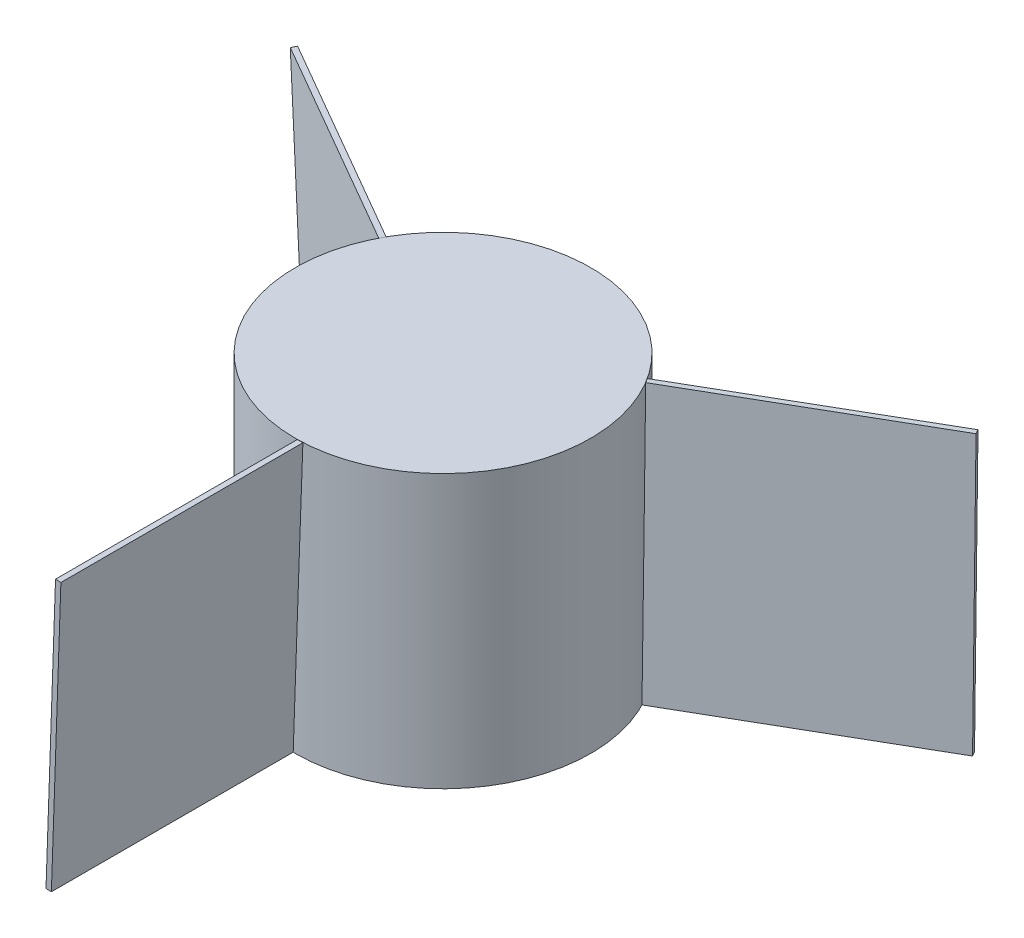
ISO-10303-21;
HEADER;
FILE_DESCRIPTION(('STEP AP214'),'2;1');
FILE_NAME('part.step','',(''),(''),'','','');
FILE_SCHEMA(('AUTOMOTIVE_DESIGN { 1 0 10303 214 1 1 1 1 }'));
ENDSEC;
DATA;
#1=APPLICATION_CONTEXT('core data for automotive mechanical design processes');
#2=APPLICATION_PROTOCOL_DEFINITION('international standard','automotive_design',2000,#1);
#3=PRODUCT_CONTEXT('',#1,'mechanical');
#4=PRODUCT('Part','Part','',(#3));
#5=PRODUCT_RELATED_PRODUCT_CATEGORY('part','',(#4));
#6=PRODUCT_DEFINITION_FORMATION('','',#4);
#7=PRODUCT_DEFINITION_CONTEXT('part definition',#1,'design');
#8=PRODUCT_DEFINITION('design','',#6,#7);
#9=PRODUCT_DEFINITION_SHAPE('','',#8);
#10=(LENGTH_UNIT() NAMED_UNIT(*) SI_UNIT(.MILLI.,.METRE.));
#11=(NAMED_UNIT(*) PLANE_ANGLE_UNIT() SI_UNIT($,.RADIAN.));
#12=(NAMED_UNIT(*) SI_UNIT($,.STERADIAN.) SOLID_ANGLE_UNIT());
#13=UNCERTAINTY_MEASURE_WITH_UNIT(LENGTH_MEASURE(1.E-05),#10,'distance_accuracy_value','');
#14=(GEOMETRIC_REPRESENTATION_CONTEXT(3) GLOBAL_UNCERTAINTY_ASSIGNED_CONTEXT((#13)) GLOBAL_UNIT_ASSIGNED_CONTEXT((#10,
#11,#12)) REPRESENTATION_CONTEXT('',''));
#15=CARTESIAN_POINT('',(0.,0.,0.));
#16=DIRECTION('',(0.,0.,1.));
#17=DIRECTION('',(1.,0.,0.));
#18=AXIS2_PLACEMENT_3D('',#15,#16,#17);
#19=CARTESIAN_POINT('',(0.,152.4,0.));
#20=DIRECTION('',(0.,-1.,0.));
#21=DIRECTION('',(0.,0.,-1.));
#22=AXIS2_PLACEMENT_3D('',#19,#20,#21);
#23=CYLINDRICAL_SURFACE('',#22,82.5);
#24=CARTESIAN_POINT('',(0.,0.,0.));
#25=DIRECTION('',(0.,1.,0.));
#26=DIRECTION('',(0.,0.,1.));
#27=AXIS2_PLACEMENT_3D('',#24,#25,#26);
#28=CIRCLE('',#27,82.5);
#29=CARTESIAN_POINT('',(0.,0.,82.5));
#30=VERTEX_POINT('',#29);
#31=EDGE_CURVE('E190',#30,#30,#28,.T.);
#32=ORIENTED_EDGE('',*,*,#31,.T.);
#33=EDGE_LOOP('',(#32));
#34=FACE_BOUND('',#33,.T.);
#35=CARTESIAN_POINT('',(0.,152.4,0.));
#36=DIRECTION('',(0.,1.,0.));
#37=DIRECTION('',(0.,0.,1.));
#38=AXIS2_PLACEMENT_3D('',#35,#36,#37);
#39=CIRCLE('',#38,82.5);
#40=CARTESIAN_POINT('',(0.,152.4,82.5));
#41=VERTEX_POINT('',#40);
#42=EDGE_CURVE('E191',#41,#41,#39,.T.);
#43=ORIENTED_EDGE('',*,*,#42,.F.);
#44=EDGE_LOOP('',(#43));
#45=FACE_BOUND('',#44,.T.);
#46=CARTESIAN_POINT('',(0.,152.4,0.));
#47=DIRECTION('',(-0.034899496702501,-0.999390827019096,0.));
#48=DIRECTION('',(0.999390827019096,-0.034899496702501,0.));
#49=AXIS2_PLACEMENT_3D('',#46,#47,#48);
#50=ELLIPSE('',#49,82.5502874046528,82.5);
#51=CARTESIAN_POINT('',(4.15680789017982,152.254841069846,82.3952119249908));
#52=VERTEX_POINT('',#51);
#53=CARTESIAN_POINT('',(1.15863540912254,152.359539559953,82.4918636229582));
#54=VERTEX_POINT('',#53);
#55=EDGE_CURVE('E202',#52,#54,#50,.T.);
#56=ORIENTED_EDGE('',*,*,#55,.F.);
#57=CARTESIAN_POINT('',(0.,33.2194374782343,0.));
#58=DIRECTION('',(0.999390827019096,-0.034899496702501,0.));
#59=DIRECTION('',(-0.034899496702501,-0.999390827019096,0.));
#60=AXIS2_PLACEMENT_3D('',#57,#58,#59);
#61=ELLIPSE('',#60,2363.93093869711,82.5);
#62=CARTESIAN_POINT('',(-1.15863540912254,0.0404604400469349,82.4918636229581));
#63=VERTEX_POINT('',#62);
#64=EDGE_CURVE('E205',#52,#63,#61,.T.);
#65=ORIENTED_EDGE('',*,*,#64,.T.);
#66=CARTESIAN_POINT('',(0.,0.,0.));
#67=DIRECTION('',(0.034899496702501,0.999390827019096,0.));
#68=DIRECTION('',(0.999390827019096,-0.034899496702501,0.));
#69=AXIS2_PLACEMENT_3D('',#66,#67,#68);
#70=ELLIPSE('',#69,82.5502874046528,82.5);
#71=CARTESIAN_POINT('',(-4.15680789017982,0.145158930154438,82.3952119249908));
#72=VERTEX_POINT('',#71);
#73=EDGE_CURVE('E199',#72,#63,#70,.T.);
#74=ORIENTED_EDGE('',*,*,#73,.F.);
#75=CARTESIAN_POINT('',(0.,119.180562521766,0.));
#76=DIRECTION('',(0.999390827019096,-0.034899496702501,0.));
#77=DIRECTION('',(-0.034899496702501,-0.999390827019096,0.));
#78=AXIS2_PLACEMENT_3D('',#75,#76,#77);
#79=ELLIPSE('',#78,2363.93093869711,82.5);
#80=EDGE_CURVE('E194',#54,#72,#79,.T.);
#81=ORIENTED_EDGE('',*,*,#80,.F.);
#82=EDGE_LOOP('',(#56,#65,#74,#81));
#83=FACE_BOUND('',#82,.T.);
#84=CARTESIAN_POINT('',(0.,152.4,0.));
#85=DIRECTION('',(0.0174497483512501,-0.999390827019096,0.0302238507236574));
#86=DIRECTION('',(-0.499695413509537,-0.034899496702501,-0.865497844507683));
#87=AXIS2_PLACEMENT_3D('',#84,#85,#86);
#88=ELLIPSE('',#87,82.5502874046528,82.5);
#89=CARTESIAN_POINT('',(69.277942732155,152.254841069846,-44.797507194042));
#90=VERTEX_POINT('',#89);
#91=CARTESIAN_POINT('',(70.8607317984423,152.359539559953,-42.2493395095027));
#92=VERTEX_POINT('',#91);
#93=EDGE_CURVE('E55',#90,#92,#88,.T.);
#94=ORIENTED_EDGE('',*,*,#93,.F.);
#95=CARTESIAN_POINT('',(0.,33.2194374782344,0.));
#96=DIRECTION('',(-0.49969541350954,-0.034899496702501,-0.865497844507681));
#97=DIRECTION('',(0.0174497483512502,-0.999390827019096,0.0302238507236573));
#98=AXIS2_PLACEMENT_3D('',#95,#96,#97);
#99=ELLIPSE('',#98,2363.93093869711,82.5);
#100=CARTESIAN_POINT('',(72.0193672075648,0.0404604400469349,-40.2425241134541));
#101=VERTEX_POINT('',#100);
#102=EDGE_CURVE('E126',#90,#101,#99,.T.);
#103=ORIENTED_EDGE('',*,*,#102,.T.);
#104=CARTESIAN_POINT('',(0.,0.,0.));
#105=DIRECTION('',(-0.0174497483512501,0.999390827019096,-0.0302238507236574));
#106=DIRECTION('',(-0.499695413509537,-0.034899496702501,-0.865497844507683));
#107=AXIS2_PLACEMENT_3D('',#104,#105,#106);
#108=ELLIPSE('',#107,82.5502874046528,82.5);
#109=CARTESIAN_POINT('',(73.4347506223348,0.145158930154438,-37.5977047309474));
#110=VERTEX_POINT('',#109);
#111=EDGE_CURVE('E210',#110,#101,#108,.T.);
#112=ORIENTED_EDGE('',*,*,#111,.F.);
#113=CARTESIAN_POINT('',(0.,119.180562521766,0.));
#114=DIRECTION('',(-0.49969541350954,-0.034899496702501,-0.865497844507681));
#115=DIRECTION('',(0.0174497483512502,-0.999390827019096,0.0302238507236573));
#116=AXIS2_PLACEMENT_3D('',#113,#114,#115);
#117=ELLIPSE('',#116,2363.93093869711,82.5);
#118=EDGE_CURVE('E207',#92,#110,#117,.T.);
#119=ORIENTED_EDGE('',*,*,#118,.F.);
#120=EDGE_LOOP('',(#94,#103,#112,#119));
#121=FACE_BOUND('',#120,.T.);
#122=CARTESIAN_POINT('',(0.,119.180562521766,0.));
#123=DIRECTION('',(-0.499695413509552,-0.034899496702501,0.865497844507674));
#124=DIRECTION('',(0.0174497483512507,-0.999390827019096,-0.0302238507236571));
#125=AXIS2_PLACEMENT_3D('',#122,#123,#124);
#126=ELLIPSE('',#125,2363.93093869711,82.5);
#127=CARTESIAN_POINT('',(-72.0193672075642,152.359539559953,-40.2425241134551));
#128=VERTEX_POINT('',#127);
#129=CARTESIAN_POINT('',(-69.2779427321544,0.145158930154438,-44.797507194043));
#130=VERTEX_POINT('',#129);
#131=EDGE_CURVE('E11',#128,#130,#126,.T.);
#132=ORIENTED_EDGE('',*,*,#131,.F.);
#133=CARTESIAN_POINT('',(0.,152.4,0.));
#134=DIRECTION('',(0.0174497483512508,-0.999390827019096,-0.030223850723657));
#135=DIRECTION('',(-0.499695413509555,-0.034899496702501,0.865497844507672));
#136=AXIS2_PLACEMENT_3D('',#133,#134,#135);
#137=ELLIPSE('',#136,82.5502874046528,82.5);
#138=CARTESIAN_POINT('',(-73.4347506223342,152.254841069846,-37.5977047309484));
#139=VERTEX_POINT('',#138);
#140=EDGE_CURVE('E40',#139,#128,#137,.T.);
#141=ORIENTED_EDGE('',*,*,#140,.F.);
#142=CARTESIAN_POINT('',(0.,33.2194374782344,0.));
#143=DIRECTION('',(-0.499695413509552,-0.034899496702501,0.865497844507674));
#144=DIRECTION('',(0.0174497483512507,-0.999390827019096,-0.0302238507236571));
#145=AXIS2_PLACEMENT_3D('',#142,#143,#144);
#146=ELLIPSE('',#145,2363.93093869711,82.5);
#147=CARTESIAN_POINT('',(-70.8607317984417,0.0404604400469349,-42.2493395095037));
#148=VERTEX_POINT('',#147);
#149=EDGE_CURVE('E215',#139,#148,#146,.T.);
#150=ORIENTED_EDGE('',*,*,#149,.T.);
#151=CARTESIAN_POINT('',(0.,0.,0.));
#152=DIRECTION('',(-0.0174497483512508,0.999390827019096,0.030223850723657));
#153=DIRECTION('',(-0.499695413509555,-0.034899496702501,0.865497844507673));
#154=AXIS2_PLACEMENT_3D('',#151,#152,#153);
#155=ELLIPSE('',#154,82.5502874046528,82.5);
#156=EDGE_CURVE('E218',#130,#148,#155,.T.);
#157=ORIENTED_EDGE('',*,*,#156,.F.);
#158=EDGE_LOOP('',(#132,#141,#150,#157));
#159=FACE_BOUND('',#158,.T.);
#160=ADVANCED_FACE('F33',(#34,#45,#83,#121,#159),#23,.T.);
#161=CARTESIAN_POINT('',(0.,152.4,0.));
#162=DIRECTION('',(0.,1.,0.));
#163=DIRECTION('',(0.,0.,1.));
#164=AXIS2_PLACEMENT_3D('',#161,#162,#163);
#165=PLANE('',#164);
#166=ORIENTED_EDGE('',*,*,#42,.T.);
#167=EDGE_LOOP('',(#166));
#168=FACE_BOUND('',#167,.T.);
#169=ADVANCED_FACE('F248',(#168),#165,.T.);
#170=CARTESIAN_POINT('',(0.,0.,0.));
#171=DIRECTION('',(0.,1.,0.));
#172=DIRECTION('',(0.,0.,1.));
#173=AXIS2_PLACEMENT_3D('',#170,#171,#172);
#174=PLANE('',#173);
#175=ORIENTED_EDGE('',*,*,#31,.F.);
#176=EDGE_LOOP('',(#175));
#177=FACE_BOUND('',#176,.T.);
#178=ADVANCED_FACE('F253',(#177),#174,.F.);
#179=CARTESIAN_POINT('',(4.15680789017982,152.254841069846,0.));
#180=DIRECTION('',(-0.034899496702501,-0.999390827019096,0.));
#181=DIRECTION('',(0.999390827019096,-0.034899496702501,0.));
#182=AXIS2_PLACEMENT_3D('',#179,#180,#181);
#183=PLANE('',#182);
#184=DIRECTION('',(0.,0.,1.));
#185=VECTOR('',#184,1.);
#186=CARTESIAN_POINT('',(4.15680789017982,152.254841069846,0.));
#187=LINE('',#186,#185);
#188=CARTESIAN_POINT('',(4.15680789017982,152.254841069846,217.5));
#189=VERTEX_POINT('',#188);
#190=EDGE_CURVE('E171',#52,#189,#187,.T.);
#191=ORIENTED_EDGE('',*,*,#190,.F.);
#192=ORIENTED_EDGE('',*,*,#55,.T.);
#193=DIRECTION('',(0.,0.,1.));
#194=VECTOR('',#193,1.);
#195=CARTESIAN_POINT('',(1.15863540912254,152.359539559953,0.));
#196=LINE('',#195,#194);
#197=CARTESIAN_POINT('',(1.15863540912253,152.359539559953,217.5));
#198=VERTEX_POINT('',#197);
#199=EDGE_CURVE('E170',#54,#198,#196,.T.);
#200=ORIENTED_EDGE('',*,*,#199,.T.);
#201=DIRECTION('',(-0.999390827019096,0.034899496702501,0.));
#202=VECTOR('',#201,1.);
#203=CARTESIAN_POINT('',(4.15680789017982,152.254841069846,217.5));
#204=LINE('',#203,#202);
#205=EDGE_CURVE('E187',#189,#198,#204,.T.);
#206=ORIENTED_EDGE('',*,*,#205,.F.);
#207=EDGE_LOOP('',(#191,#192,#200,#206));
#208=FACE_BOUND('',#207,.T.);
#209=ADVANCED_FACE('F268',(#208),#183,.F.);
#210=CARTESIAN_POINT('',(-1.15863540912254,0.0404604400469184,217.5));
#211=DIRECTION('',(0.,0.,-1.));
#212=DIRECTION('',(-1.,0.,0.));
#213=AXIS2_PLACEMENT_3D('',#210,#211,#212);
#214=PLANE('',#213);
#215=DIRECTION('',(-0.034899496702501,-0.999390827019096,0.));
#216=VECTOR('',#215,1.);
#217=CARTESIAN_POINT('',(-4.15680789017982,0.145158930154422,217.5));
#218=LINE('',#217,#216);
#219=CARTESIAN_POINT('',(-4.15680789017982,0.145158930154422,217.5));
#220=VERTEX_POINT('',#219);
#221=EDGE_CURVE('E181',#198,#220,#218,.T.);
#222=ORIENTED_EDGE('',*,*,#221,.T.);
#223=DIRECTION('',(-0.999390827019096,0.034899496702501,0.));
#224=VECTOR('',#223,1.);
#225=CARTESIAN_POINT('',(-1.15863540912254,0.0404604400469184,217.5));
#226=LINE('',#225,#224);
#227=CARTESIAN_POINT('',(-1.15863540912254,0.0404604400469184,217.5));
#228=VERTEX_POINT('',#227);
#229=EDGE_CURVE('E179',#228,#220,#226,.T.);
#230=ORIENTED_EDGE('',*,*,#229,.F.);
#231=DIRECTION('',(-0.034899496702501,-0.999390827019096,0.));
#232=VECTOR('',#231,1.);
#233=CARTESIAN_POINT('',(-1.15863540912254,0.0404604400469184,217.5));
#234=LINE('',#233,#232);
#235=EDGE_CURVE('E173',#189,#228,#234,.T.);
#236=ORIENTED_EDGE('',*,*,#235,.F.);
#237=ORIENTED_EDGE('',*,*,#205,.T.);
#238=EDGE_LOOP('',(#222,#230,#236,#237));
#239=FACE_BOUND('',#238,.T.);
#240=ADVANCED_FACE('F273',(#239),#214,.F.);
#241=CARTESIAN_POINT('',(-1.15863540912254,0.040460440046945,0.));
#242=DIRECTION('',(0.034899496702501,0.999390827019096,0.));
#243=DIRECTION('',(-0.999390827019096,0.034899496702501,0.));
#244=AXIS2_PLACEMENT_3D('',#241,#242,#243);
#245=PLANE('',#244);
#246=DIRECTION('',(0.,0.,-1.));
#247=VECTOR('',#246,1.);
#248=CARTESIAN_POINT('',(-4.15680789017982,0.145158930154448,0.));
#249=LINE('',#248,#247);
#250=EDGE_CURVE('E174',#220,#72,#249,.T.);
#251=ORIENTED_EDGE('',*,*,#250,.T.);
#252=ORIENTED_EDGE('',*,*,#73,.T.);
#253=DIRECTION('',(0.,0.,-1.));
#254=VECTOR('',#253,1.);
#255=CARTESIAN_POINT('',(-1.15863540912254,0.040460440046945,0.));
#256=LINE('',#255,#254);
#257=EDGE_CURVE('E176',#228,#63,#256,.T.);
#258=ORIENTED_EDGE('',*,*,#257,.F.);
#259=ORIENTED_EDGE('',*,*,#229,.T.);
#260=EDGE_LOOP('',(#251,#252,#258,#259));
#261=FACE_BOUND('',#260,.T.);
#262=ADVANCED_FACE('F276',(#261),#245,.F.);
#263=CARTESIAN_POINT('',(-1.15863540912254,0.040460440046945,0.));
#264=DIRECTION('',(0.999390827019096,-0.034899496702501,0.));
#265=DIRECTION('',(0.034899496702501,0.999390827019096,0.));
#266=AXIS2_PLACEMENT_3D('',#263,#264,#265);
#267=PLANE('',#266);
#268=ORIENTED_EDGE('',*,*,#64,.F.);
#269=ORIENTED_EDGE('',*,*,#190,.T.);
#270=ORIENTED_EDGE('',*,*,#235,.T.);
#271=ORIENTED_EDGE('',*,*,#257,.T.);
#272=EDGE_LOOP('',(#268,#269,#270,#271));
#273=FACE_BOUND('',#272,.T.);
#274=ADVANCED_FACE('F265',(#273),#267,.T.);
#275=CARTESIAN_POINT('',(-4.15680789017982,0.145158930154448,0.));
#276=DIRECTION('',(0.999390827019096,-0.034899496702501,0.));
#277=DIRECTION('',(0.034899496702501,0.999390827019096,0.));
#278=AXIS2_PLACEMENT_3D('',#275,#276,#277);
#279=PLANE('',#278);
#280=ORIENTED_EDGE('',*,*,#199,.F.);
#281=ORIENTED_EDGE('',*,*,#80,.T.);
#282=ORIENTED_EDGE('',*,*,#250,.F.);
#283=ORIENTED_EDGE('',*,*,#221,.F.);
#284=EDGE_LOOP('',(#280,#281,#282,#283));
#285=FACE_BOUND('',#284,.T.);
#286=ADVANCED_FACE('F278',(#285),#279,.F.);
#287=CARTESIAN_POINT('',(188.939843027678,0.0404604400469184,-107.746592301974));
#288=DIRECTION('',(-0.866025403784443,0.,0.499999999999992));
#289=DIRECTION('',(0.499999999999992,0.,0.866025403784443));
#290=AXIS2_PLACEMENT_3D('',#287,#288,#289);
#291=PLANE('',#290);
#292=DIRECTION('',(0.0174497483512502,-0.999390827019096,0.0302238507236573));
#293=VECTOR('',#292,1.);
#294=CARTESIAN_POINT('',(190.438929268206,0.145158930154422,-105.150098768451));
#295=LINE('',#294,#293);
#296=CARTESIAN_POINT('',(187.781207618555,152.359539559953,-109.753407698023));
#297=VERTEX_POINT('',#296);
#298=CARTESIAN_POINT('',(190.438929268206,0.145158930154422,-105.150098768451));
#299=VERTEX_POINT('',#298);
#300=EDGE_CURVE('E148',#297,#299,#295,.T.);
#301=ORIENTED_EDGE('',*,*,#300,.T.);
#302=DIRECTION('',(0.49969541350954,0.034899496702501,0.865497844507681));
#303=VECTOR('',#302,1.);
#304=CARTESIAN_POINT('',(188.939843027678,0.0404604400469184,-107.746592301974));
#305=LINE('',#304,#303);
#306=CARTESIAN_POINT('',(188.939843027678,0.0404604400469184,-107.746592301974));
#307=VERTEX_POINT('',#306);
#308=EDGE_CURVE('E138',#307,#299,#305,.T.);
#309=ORIENTED_EDGE('',*,*,#308,.F.);
#310=DIRECTION('',(0.0174497483512502,-0.999390827019096,0.0302238507236573));
#311=VECTOR('',#310,1.);
#312=CARTESIAN_POINT('',(188.939843027678,0.0404604400469184,-107.746592301974));
#313=LINE('',#312,#311);
#314=CARTESIAN_POINT('',(186.282121378027,152.254841069846,-112.349901231546));
#315=VERTEX_POINT('',#314);
#316=EDGE_CURVE('E124',#315,#307,#313,.T.);
#317=ORIENTED_EDGE('',*,*,#316,.F.);
#318=DIRECTION('',(0.49969541350954,0.034899496702501,0.865497844507681));
#319=VECTOR('',#318,1.);
#320=CARTESIAN_POINT('',(186.282121378027,152.254841069846,-112.349901231546));
#321=LINE('',#320,#319);
#322=EDGE_CURVE('E131',#315,#297,#321,.T.);
#323=ORIENTED_EDGE('',*,*,#322,.T.);
#324=EDGE_LOOP('',(#301,#309,#317,#323));
#325=FACE_BOUND('',#324,.T.);
#326=ADVANCED_FACE('F140',(#325),#291,.F.);
#327=CARTESIAN_POINT('',(2.07840394508988,0.145158930154448,3.59990123154734));
#328=DIRECTION('',(-0.49969541350954,-0.034899496702501,-0.865497844507681));
#329=DIRECTION('',(-0.0174497483512502,0.999390827019096,-0.0302238507236573));
#330=AXIS2_PLACEMENT_3D('',#327,#328,#329);
#331=PLANE('',#330);
#332=DIRECTION('',(0.866025403784443,0.,-0.499999999999992));
#333=VECTOR('',#332,1.);
#334=CARTESIAN_POINT('',(-0.579317704561258,152.359539559953,-1.0034076980243));
#335=LINE('',#334,#333);
#336=EDGE_CURVE('E134',#92,#297,#335,.T.);
#337=ORIENTED_EDGE('',*,*,#336,.F.);
#338=ORIENTED_EDGE('',*,*,#118,.T.);
#339=DIRECTION('',(-0.866025403784443,0.,0.499999999999992));
#340=VECTOR('',#339,1.);
#341=CARTESIAN_POINT('',(2.07840394508988,0.145158930154448,3.59990123154734));
#342=LINE('',#341,#340);
#343=EDGE_CURVE('E128',#299,#110,#342,.T.);
#344=ORIENTED_EDGE('',*,*,#343,.F.);
#345=ORIENTED_EDGE('',*,*,#300,.F.);
#346=EDGE_LOOP('',(#337,#338,#344,#345));
#347=FACE_BOUND('',#346,.T.);
#348=ADVANCED_FACE('F285',(#347),#331,.F.);
#349=CARTESIAN_POINT('',(0.579317704561259,0.040460440046945,1.0034076980243));
#350=DIRECTION('',(-0.0174497483512501,0.999390827019096,-0.0302238507236574));
#351=DIRECTION('',(0.,0.0302284532610992,0.999543015889482));
#352=AXIS2_PLACEMENT_3D('',#349,#350,#351);
#353=PLANE('',#352);
#354=ORIENTED_EDGE('',*,*,#343,.T.);
#355=ORIENTED_EDGE('',*,*,#111,.T.);
#356=DIRECTION('',(-0.866025403784443,0.,0.499999999999992));
#357=VECTOR('',#356,1.);
#358=CARTESIAN_POINT('',(0.579317704561259,0.040460440046945,1.0034076980243));
#359=LINE('',#358,#357);
#360=EDGE_CURVE('E143',#307,#101,#359,.T.);
#361=ORIENTED_EDGE('',*,*,#360,.F.);
#362=ORIENTED_EDGE('',*,*,#308,.T.);
#363=EDGE_LOOP('',(#354,#355,#361,#362));
#364=FACE_BOUND('',#363,.T.);
#365=ADVANCED_FACE('F340',(#364),#353,.F.);
#366=CARTESIAN_POINT('',(-2.07840394508988,152.254841069846,-3.59990123154734));
#367=DIRECTION('',(0.0174497483512501,-0.999390827019096,0.0302238507236574));
#368=DIRECTION('',(0.,-0.0302284532610992,-0.999543015889482));
#369=AXIS2_PLACEMENT_3D('',#366,#367,#368);
#370=PLANE('',#369);
#371=DIRECTION('',(0.866025403784443,0.,-0.499999999999992));
#372=VECTOR('',#371,1.);
#373=CARTESIAN_POINT('',(-2.07840394508988,152.254841069846,-3.59990123154734));
#374=LINE('',#373,#372);
#375=EDGE_CURVE('E119',#90,#315,#374,.T.);
#376=ORIENTED_EDGE('',*,*,#375,.F.);
#377=ORIENTED_EDGE('',*,*,#93,.T.);
#378=ORIENTED_EDGE('',*,*,#336,.T.);
#379=ORIENTED_EDGE('',*,*,#322,.F.);
#380=EDGE_LOOP('',(#376,#377,#378,#379));
#381=FACE_BOUND('',#380,.T.);
#382=ADVANCED_FACE('F132',(#381),#370,.F.);
#383=CARTESIAN_POINT('',(0.579317704561259,0.040460440046945,1.0034076980243));
#384=DIRECTION('',(-0.49969541350954,-0.034899496702501,-0.865497844507681));
#385=DIRECTION('',(-0.0174497483512502,0.999390827019096,-0.0302238507236573));
#386=AXIS2_PLACEMENT_3D('',#383,#384,#385);
#387=PLANE('',#386);
#388=ORIENTED_EDGE('',*,*,#102,.F.);
#389=ORIENTED_EDGE('',*,*,#375,.T.);
#390=ORIENTED_EDGE('',*,*,#316,.T.);
#391=ORIENTED_EDGE('',*,*,#360,.T.);
#392=EDGE_LOOP('',(#388,#389,#390,#391));
#393=FACE_BOUND('',#392,.T.);
#394=ADVANCED_FACE('F121',(#393),#387,.T.);
#395=CARTESIAN_POINT('',(2.07840394508993,0.145158930154448,-3.59990123154731));
#396=DIRECTION('',(-0.499695413509552,-0.034899496702501,0.865497844507674));
#397=DIRECTION('',(-0.0174497483512507,0.999390827019096,0.0302238507236571));
#398=AXIS2_PLACEMENT_3D('',#395,#396,#397);
#399=PLANE('',#398);
#400=DIRECTION('',(-0.866025403784436,0.,-0.500000000000004));
#401=VECTOR('',#400,1.);
#402=CARTESIAN_POINT('',(-0.579317704561273,152.359539559953,1.00340769802429));
#403=LINE('',#402,#401);
#404=CARTESIAN_POINT('',(-188.939843027676,152.359539559953,-107.746592301977));
#405=VERTEX_POINT('',#404);
#406=EDGE_CURVE('E137',#128,#405,#403,.T.);
#407=ORIENTED_EDGE('',*,*,#406,.F.);
#408=ORIENTED_EDGE('',*,*,#131,.T.);
#409=DIRECTION('',(0.866025403784436,0.,0.500000000000004));
#410=VECTOR('',#409,1.);
#411=CARTESIAN_POINT('',(2.07840394508993,0.145158930154448,-3.59990123154731));
#412=LINE('',#411,#410);
#413=CARTESIAN_POINT('',(-186.282121378025,0.145158930154421,-112.349901231548));
#414=VERTEX_POINT('',#413);
#415=EDGE_CURVE('E156',#414,#130,#412,.T.);
#416=ORIENTED_EDGE('',*,*,#415,.F.);
#417=DIRECTION('',(0.0174497483512507,-0.999390827019096,-0.0302238507236571));
#418=VECTOR('',#417,1.);
#419=CARTESIAN_POINT('',(-186.282121378025,0.145158930154421,-112.349901231548));
#420=LINE('',#419,#418);
#421=EDGE_CURVE('E161',#405,#414,#420,.T.);
#422=ORIENTED_EDGE('',*,*,#421,.F.);
#423=EDGE_LOOP('',(#407,#408,#416,#422));
#424=FACE_BOUND('',#423,.T.);
#425=ADVANCED_FACE('F229',(#424),#399,.F.);
#426=CARTESIAN_POINT('',(-2.07840394508993,152.254841069846,3.59990123154731));
#427=DIRECTION('',(0.0174497483512508,-0.999390827019096,-0.030223850723657));
#428=DIRECTION('',(0.,0.0302284532610988,-0.999543015889482));
#429=AXIS2_PLACEMENT_3D('',#426,#427,#428);
#430=PLANE('',#429);
#431=DIRECTION('',(-0.866025403784436,0.,-0.500000000000004));
#432=VECTOR('',#431,1.);
#433=CARTESIAN_POINT('',(-2.07840394508993,152.254841069846,3.59990123154731));
#434=LINE('',#433,#432);
#435=CARTESIAN_POINT('',(-190.438929268205,152.254841069846,-105.150098768454));
#436=VERTEX_POINT('',#435);
#437=EDGE_CURVE('E153',#139,#436,#434,.T.);
#438=ORIENTED_EDGE('',*,*,#437,.F.);
#439=ORIENTED_EDGE('',*,*,#140,.T.);
#440=ORIENTED_EDGE('',*,*,#406,.T.);
#441=DIRECTION('',(0.499695413509552,0.034899496702501,-0.865497844507674));
#442=VECTOR('',#441,1.);
#443=CARTESIAN_POINT('',(-190.438929268205,152.254841069846,-105.150098768454));
#444=LINE('',#443,#442);
#445=EDGE_CURVE('E167',#436,#405,#444,.T.);
#446=ORIENTED_EDGE('',*,*,#445,.F.);
#447=EDGE_LOOP('',(#438,#439,#440,#446));
#448=FACE_BOUND('',#447,.T.);
#449=ADVANCED_FACE('F223',(#448),#430,.F.);
#450=CARTESIAN_POINT('',(-187.781207618554,0.0404604400469184,-109.753407698025));
#451=DIRECTION('',(0.866025403784436,0.,0.500000000000004));
#452=DIRECTION('',(0.500000000000004,0.,-0.866025403784436));
#453=AXIS2_PLACEMENT_3D('',#450,#451,#452);
#454=PLANE('',#453);
#455=ORIENTED_EDGE('',*,*,#421,.T.);
#456=DIRECTION('',(0.499695413509552,0.034899496702501,-0.865497844507674));
#457=VECTOR('',#456,1.);
#458=CARTESIAN_POINT('',(-187.781207618554,0.0404604400469184,-109.753407698025));
#459=LINE('',#458,#457);
#460=CARTESIAN_POINT('',(-187.781207618554,0.0404604400469184,-109.753407698025));
#461=VERTEX_POINT('',#460);
#462=EDGE_CURVE('E159',#461,#414,#459,.T.);
#463=ORIENTED_EDGE('',*,*,#462,.F.);
#464=DIRECTION('',(0.0174497483512507,-0.999390827019096,-0.0302238507236571));
#465=VECTOR('',#464,1.);
#466=CARTESIAN_POINT('',(-187.781207618554,0.0404604400469184,-109.753407698025));
#467=LINE('',#466,#465);
#468=EDGE_CURVE('E155',#436,#461,#467,.T.);
#469=ORIENTED_EDGE('',*,*,#468,.F.);
#470=ORIENTED_EDGE('',*,*,#445,.T.);
#471=EDGE_LOOP('',(#455,#463,#469,#470));
#472=FACE_BOUND('',#471,.T.);
#473=ADVANCED_FACE('F237',(#472),#454,.F.);
#474=CARTESIAN_POINT('',(0.579317704561273,0.040460440046945,-1.00340769802429));
#475=DIRECTION('',(-0.0174497483512508,0.999390827019096,0.030223850723657));
#476=DIRECTION('',(0.,-0.0302284532610988,0.999543015889482));
#477=AXIS2_PLACEMENT_3D('',#474,#475,#476);
#478=PLANE('',#477);
#479=ORIENTED_EDGE('',*,*,#415,.T.);
#480=ORIENTED_EDGE('',*,*,#156,.T.);
#481=DIRECTION('',(0.866025403784436,0.,0.500000000000004));
#482=VECTOR('',#481,1.);
#483=CARTESIAN_POINT('',(0.579317704561273,0.040460440046945,-1.00340769802429));
#484=LINE('',#483,#482);
#485=EDGE_CURVE('E47',#461,#148,#484,.T.);
#486=ORIENTED_EDGE('',*,*,#485,.F.);
#487=ORIENTED_EDGE('',*,*,#462,.T.);
#488=EDGE_LOOP('',(#479,#480,#486,#487));
#489=FACE_BOUND('',#488,.T.);
#490=ADVANCED_FACE('F233',(#489),#478,.F.);
#491=CARTESIAN_POINT('',(0.579317704561273,0.040460440046945,-1.00340769802429));
#492=DIRECTION('',(-0.499695413509552,-0.034899496702501,0.865497844507674));
#493=DIRECTION('',(-0.0174497483512507,0.999390827019096,0.0302238507236571));
#494=AXIS2_PLACEMENT_3D('',#491,#492,#493);
#495=PLANE('',#494);
#496=ORIENTED_EDGE('',*,*,#149,.F.);
#497=ORIENTED_EDGE('',*,*,#437,.T.);
#498=ORIENTED_EDGE('',*,*,#468,.T.);
#499=ORIENTED_EDGE('',*,*,#485,.T.);
#500=EDGE_LOOP('',(#496,#497,#498,#499));
#501=FACE_BOUND('',#500,.T.);
#502=ADVANCED_FACE('F238',(#501),#495,.T.);
#503=CLOSED_SHELL('',(#160,#169,#178,#209,#240,#262,#274,#286,#326,#348,#365,#382,#394,#425,
#449,#473,#490,#502));
#504=MANIFOLD_SOLID_BREP('B2',#503);
#505=ADVANCED_BREP_SHAPE_REPRESENTATION('',(#18,#504),#14);
#506=SHAPE_DEFINITION_REPRESENTATION(#9,#505);
ENDSEC;
END-ISO-10303-21;
